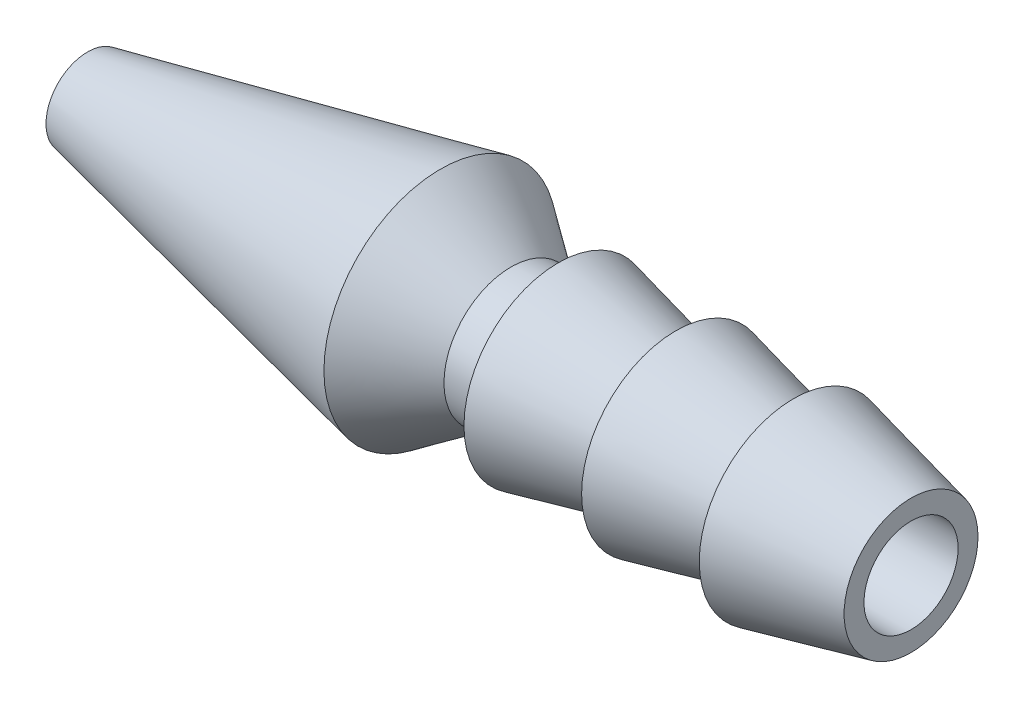
ISO-10303-21;
HEADER;
FILE_DESCRIPTION(('STEP AP214'),'2;1');
FILE_NAME('part.step','',(''),(''),'','','');
FILE_SCHEMA(('AUTOMOTIVE_DESIGN { 1 0 10303 214 1 1 1 1 }'));
ENDSEC;
DATA;
#1=APPLICATION_CONTEXT('core data for automotive mechanical design processes');
#2=APPLICATION_PROTOCOL_DEFINITION('international standard','automotive_design',2000,#1);
#3=PRODUCT_CONTEXT('',#1,'mechanical');
#4=PRODUCT('Part','Part','',(#3));
#5=PRODUCT_RELATED_PRODUCT_CATEGORY('part','',(#4));
#6=PRODUCT_DEFINITION_FORMATION('','',#4);
#7=PRODUCT_DEFINITION_CONTEXT('part definition',#1,'design');
#8=PRODUCT_DEFINITION('design','',#6,#7);
#9=PRODUCT_DEFINITION_SHAPE('','',#8);
#10=(LENGTH_UNIT() NAMED_UNIT(*) SI_UNIT(.MILLI.,.METRE.));
#11=(NAMED_UNIT(*) PLANE_ANGLE_UNIT() SI_UNIT($,.RADIAN.));
#12=(NAMED_UNIT(*) SI_UNIT($,.STERADIAN.) SOLID_ANGLE_UNIT());
#13=UNCERTAINTY_MEASURE_WITH_UNIT(LENGTH_MEASURE(1.E-05),#10,'distance_accuracy_value','');
#14=(GEOMETRIC_REPRESENTATION_CONTEXT(3) GLOBAL_UNCERTAINTY_ASSIGNED_CONTEXT((#13)) GLOBAL_UNIT_ASSIGNED_CONTEXT((#10,
#11,#12)) REPRESENTATION_CONTEXT('',''));
#15=CARTESIAN_POINT('',(0.,0.,0.));
#16=DIRECTION('',(0.,0.,1.));
#17=DIRECTION('',(1.,0.,0.));
#18=AXIS2_PLACEMENT_3D('',#15,#16,#17);
#19=CARTESIAN_POINT('',(-10.,0.,0.));
#20=DIRECTION('',(-1.,0.,0.));
#21=DIRECTION('',(0.,0.,1.));
#22=AXIS2_PLACEMENT_3D('',#19,#20,#21);
#23=PLANE('',#22);
#24=CARTESIAN_POINT('',(-10.,0.,0.));
#25=DIRECTION('',(-1.,0.,0.));
#26=DIRECTION('',(0.,0.,1.));
#27=AXIS2_PLACEMENT_3D('',#24,#25,#26);
#28=CIRCLE('',#27,1.00997333995951);
#29=CARTESIAN_POINT('',(-10.,0.2,-0.989972801358183));
#30=VERTEX_POINT('',#29);
#31=CARTESIAN_POINT('',(-10.,-0.2,-0.989972801358192));
#32=VERTEX_POINT('',#31);
#33=EDGE_CURVE('E11',#30,#32,#28,.T.);
#34=ORIENTED_EDGE('',*,*,#33,.F.);
#35=DIRECTION('',(0.,0.,-1.));
#36=VECTOR('',#35,1.);
#37=CARTESIAN_POINT('',(-10.,0.2,-1.23995684396675));
#38=LINE('',#37,#36);
#39=CARTESIAN_POINT('',(-10.,0.2,-1.23995684396675));
#40=VERTEX_POINT('',#39);
#41=EDGE_CURVE('E100',#30,#40,#38,.T.);
#42=ORIENTED_EDGE('',*,*,#41,.T.);
#43=DIRECTION('',(0.,-1.,0.));
#44=VECTOR('',#43,1.);
#45=CARTESIAN_POINT('',(-10.,0.2,-1.23995684396675));
#46=LINE('',#45,#44);
#47=CARTESIAN_POINT('',(-10.,-0.2,-1.23995684396675));
#48=VERTEX_POINT('',#47);
#49=EDGE_CURVE('E106',#40,#48,#46,.T.);
#50=ORIENTED_EDGE('',*,*,#49,.T.);
#51=DIRECTION('',(0.,0.,1.));
#52=VECTOR('',#51,1.);
#53=CARTESIAN_POINT('',(-10.,-0.2,-1.23995684396675));
#54=LINE('',#53,#52);
#55=EDGE_CURVE('E114',#48,#32,#54,.T.);
#56=ORIENTED_EDGE('',*,*,#55,.T.);
#57=EDGE_LOOP('',(#34,#42,#50,#56));
#58=FACE_BOUND('',#57,.T.);
#59=ADVANCED_FACE('F35',(#58),#23,.T.);
#60=CARTESIAN_POINT('',(0.,0.,0.));
#61=DIRECTION('',(-1.,0.,0.));
#62=DIRECTION('',(0.,0.,-1.));
#63=AXIS2_PLACEMENT_3D('',#60,#61,#62);
#64=CONICAL_SURFACE('',#63,4.,0.226892802759263);
#65=CARTESIAN_POINT('',(5.,0.,0.));
#66=DIRECTION('',(1.,0.,0.));
#67=DIRECTION('',(0.,0.,-1.));
#68=AXIS2_PLACEMENT_3D('',#65,#66,#67);
#69=CIRCLE('',#68,2.84565904437218);
#70=CARTESIAN_POINT('',(5.,0.,-2.84565904437218));
#71=VERTEX_POINT('',#70);
#72=EDGE_CURVE('E150',#71,#71,#69,.T.);
#73=ORIENTED_EDGE('',*,*,#72,.F.);
#74=EDGE_LOOP('',(#73));
#75=FACE_BOUND('',#74,.T.);
#76=CARTESIAN_POINT('',(0.,0.,0.));
#77=DIRECTION('',(1.,0.,0.));
#78=DIRECTION('',(0.,0.,-1.));
#79=AXIS2_PLACEMENT_3D('',#76,#77,#78);
#80=CIRCLE('',#79,4.);
#81=CARTESIAN_POINT('',(0.,0.,-4.));
#82=VERTEX_POINT('',#81);
#83=EDGE_CURVE('E162',#82,#82,#80,.T.);
#84=ORIENTED_EDGE('',*,*,#83,.T.);
#85=EDGE_LOOP('',(#84));
#86=FACE_BOUND('',#85,.T.);
#87=ADVANCED_FACE('F37',(#75,#86),#64,.T.);
#88=CARTESIAN_POINT('',(0.,0.,0.));
#89=DIRECTION('',(1.,0.,0.));
#90=DIRECTION('',(0.,0.,-1.));
#91=AXIS2_PLACEMENT_3D('',#88,#89,#90);
#92=PLANE('',#91);
#93=CARTESIAN_POINT('',(0.,0.,0.));
#94=DIRECTION('',(-1.,0.,0.));
#95=DIRECTION('',(0.,0.,1.));
#96=AXIS2_PLACEMENT_3D('',#93,#94,#95);
#97=CIRCLE('',#96,2.85);
#98=CARTESIAN_POINT('',(0.,0.,2.85));
#99=VERTEX_POINT('',#98);
#100=EDGE_CURVE('E92',#99,#99,#97,.T.);
#101=ORIENTED_EDGE('',*,*,#100,.F.);
#102=EDGE_LOOP('',(#101));
#103=FACE_BOUND('',#102,.T.);
#104=ORIENTED_EDGE('',*,*,#83,.F.);
#105=EDGE_LOOP('',(#104));
#106=FACE_BOUND('',#105,.T.);
#107=ADVANCED_FACE('F172',(#103,#106),#92,.F.);
#108=CARTESIAN_POINT('',(5.,0.,0.));
#109=DIRECTION('',(-1.,0.,0.));
#110=DIRECTION('',(0.,0.,-1.));
#111=AXIS2_PLACEMENT_3D('',#108,#109,#110);
#112=CONICAL_SURFACE('',#111,4.,0.226892802759263);
#113=CARTESIAN_POINT('',(10.,0.,0.));
#114=DIRECTION('',(1.,0.,0.));
#115=DIRECTION('',(0.,0.,-1.));
#116=AXIS2_PLACEMENT_3D('',#113,#114,#115);
#117=CIRCLE('',#116,2.84565904437218);
#118=CARTESIAN_POINT('',(10.,0.,-2.84565904437218));
#119=VERTEX_POINT('',#118);
#120=EDGE_CURVE('E159',#119,#119,#117,.T.);
#121=ORIENTED_EDGE('',*,*,#120,.F.);
#122=EDGE_LOOP('',(#121));
#123=FACE_BOUND('',#122,.T.);
#124=CARTESIAN_POINT('',(5.,0.,0.));
#125=DIRECTION('',(1.,0.,0.));
#126=DIRECTION('',(0.,0.,-1.));
#127=AXIS2_PLACEMENT_3D('',#124,#125,#126);
#128=CIRCLE('',#127,4.);
#129=CARTESIAN_POINT('',(5.,0.,-4.));
#130=VERTEX_POINT('',#129);
#131=EDGE_CURVE('E156',#130,#130,#128,.T.);
#132=ORIENTED_EDGE('',*,*,#131,.T.);
#133=EDGE_LOOP('',(#132));
#134=FACE_BOUND('',#133,.T.);
#135=ADVANCED_FACE('F176',(#123,#134),#112,.T.);
#136=CARTESIAN_POINT('',(5.,0.,0.));
#137=DIRECTION('',(1.,0.,0.));
#138=DIRECTION('',(0.,0.,-1.));
#139=AXIS2_PLACEMENT_3D('',#136,#137,#138);
#140=PLANE('',#139);
#141=ORIENTED_EDGE('',*,*,#72,.T.);
#142=EDGE_LOOP('',(#141));
#143=FACE_BOUND('',#142,.T.);
#144=ORIENTED_EDGE('',*,*,#131,.F.);
#145=EDGE_LOOP('',(#144));
#146=FACE_BOUND('',#145,.T.);
#147=ADVANCED_FACE('F167',(#143,#146),#140,.F.);
#148=CARTESIAN_POINT('',(10.,0.,0.));
#149=DIRECTION('',(-1.,0.,0.));
#150=DIRECTION('',(0.,0.,-1.));
#151=AXIS2_PLACEMENT_3D('',#148,#149,#150);
#152=CONICAL_SURFACE('',#151,4.,0.226892802759263);
#153=CARTESIAN_POINT('',(15.,0.,0.));
#154=DIRECTION('',(1.,0.,0.));
#155=DIRECTION('',(0.,0.,-1.));
#156=AXIS2_PLACEMENT_3D('',#153,#154,#155);
#157=CIRCLE('',#156,2.84565904437218);
#158=CARTESIAN_POINT('',(15.,0.,-2.84565904437218));
#159=VERTEX_POINT('',#158);
#160=EDGE_CURVE('E153',#159,#159,#157,.T.);
#161=ORIENTED_EDGE('',*,*,#160,.F.);
#162=EDGE_LOOP('',(#161));
#163=FACE_BOUND('',#162,.T.);
#164=CARTESIAN_POINT('',(10.,0.,0.));
#165=DIRECTION('',(1.,0.,0.));
#166=DIRECTION('',(0.,0.,-1.));
#167=AXIS2_PLACEMENT_3D('',#164,#165,#166);
#168=CIRCLE('',#167,4.);
#169=CARTESIAN_POINT('',(10.,0.,-4.));
#170=VERTEX_POINT('',#169);
#171=EDGE_CURVE('E147',#170,#170,#168,.T.);
#172=ORIENTED_EDGE('',*,*,#171,.T.);
#173=EDGE_LOOP('',(#172));
#174=FACE_BOUND('',#173,.T.);
#175=ADVANCED_FACE('F264',(#163,#174),#152,.T.);
#176=CARTESIAN_POINT('',(15.,0.,0.));
#177=DIRECTION('',(1.,0.,0.));
#178=DIRECTION('',(0.,0.,-1.));
#179=AXIS2_PLACEMENT_3D('',#176,#177,#178);
#180=PLANE('',#179);
#181=CARTESIAN_POINT('',(15.,0.,0.));
#182=DIRECTION('',(1.,0.,0.));
#183=DIRECTION('',(0.,0.,-1.));
#184=AXIS2_PLACEMENT_3D('',#181,#182,#183);
#185=CIRCLE('',#184,2.);
#186=CARTESIAN_POINT('',(15.,0.,-2.));
#187=VERTEX_POINT('',#186);
#188=EDGE_CURVE('E130',#187,#187,#185,.T.);
#189=ORIENTED_EDGE('',*,*,#188,.F.);
#190=EDGE_LOOP('',(#189));
#191=FACE_BOUND('',#190,.T.);
#192=ORIENTED_EDGE('',*,*,#160,.T.);
#193=EDGE_LOOP('',(#192));
#194=FACE_BOUND('',#193,.T.);
#195=ADVANCED_FACE('F259',(#191,#194),#180,.T.);
#196=CARTESIAN_POINT('',(10.,0.,0.));
#197=DIRECTION('',(1.,0.,0.));
#198=DIRECTION('',(0.,0.,-1.));
#199=AXIS2_PLACEMENT_3D('',#196,#197,#198);
#200=PLANE('',#199);
#201=ORIENTED_EDGE('',*,*,#120,.T.);
#202=EDGE_LOOP('',(#201));
#203=FACE_BOUND('',#202,.T.);
#204=ORIENTED_EDGE('',*,*,#171,.F.);
#205=EDGE_LOOP('',(#204));
#206=FACE_BOUND('',#205,.T.);
#207=ADVANCED_FACE('F254',(#203,#206),#200,.F.);
#208=CARTESIAN_POINT('',(-2.,0.,0.));
#209=DIRECTION('',(1.,0.,0.));
#210=DIRECTION('',(0.,0.,-1.));
#211=AXIS2_PLACEMENT_3D('',#208,#209,#210);
#212=CYLINDRICAL_SURFACE('',#211,2.85);
#213=CARTESIAN_POINT('',(-2.,0.,0.));
#214=DIRECTION('',(-1.,0.,0.));
#215=DIRECTION('',(0.,0.,1.));
#216=AXIS2_PLACEMENT_3D('',#213,#214,#215);
#217=CIRCLE('',#216,2.85);
#218=CARTESIAN_POINT('',(-2.,0.,2.85));
#219=VERTEX_POINT('',#218);
#220=EDGE_CURVE('E144',#219,#219,#217,.T.);
#221=ORIENTED_EDGE('',*,*,#220,.F.);
#222=EDGE_LOOP('',(#221));
#223=FACE_BOUND('',#222,.T.);
#224=ORIENTED_EDGE('',*,*,#100,.T.);
#225=EDGE_LOOP('',(#224));
#226=FACE_BOUND('',#225,.T.);
#227=ADVANCED_FACE('F248',(#223,#226),#212,.T.);
#228=CARTESIAN_POINT('',(-2.,0.,0.));
#229=DIRECTION('',(-1.,0.,0.));
#230=DIRECTION('',(0.,0.,1.));
#231=AXIS2_PLACEMENT_3D('',#228,#229,#230);
#232=CONICAL_SURFACE('',#231,2.85,0.610865238198016);
#233=CARTESIAN_POINT('',(-5.,0.,0.));
#234=DIRECTION('',(-1.,0.,0.));
#235=DIRECTION('',(0.,0.,1.));
#236=AXIS2_PLACEMENT_3D('',#233,#234,#235);
#237=CIRCLE('',#236,4.95062261462913);
#238=CARTESIAN_POINT('',(-5.,0.,4.95062261462913));
#239=VERTEX_POINT('',#238);
#240=EDGE_CURVE('E141',#239,#239,#237,.T.);
#241=ORIENTED_EDGE('',*,*,#240,.F.);
#242=EDGE_LOOP('',(#241));
#243=FACE_BOUND('',#242,.T.);
#244=ORIENTED_EDGE('',*,*,#220,.T.);
#245=EDGE_LOOP('',(#244));
#246=FACE_BOUND('',#245,.T.);
#247=ADVANCED_FACE('F242',(#243,#246),#232,.T.);
#248=CARTESIAN_POINT('',(-5.,0.,0.));
#249=DIRECTION('',(1.,0.,0.));
#250=DIRECTION('',(0.,0.,1.));
#251=AXIS2_PLACEMENT_3D('',#248,#249,#250);
#252=CONICAL_SURFACE('',#251,4.95062261462913,0.20943951023932);
#253=CARTESIAN_POINT('',(-20.,0.,0.));
#254=DIRECTION('',(-1.,0.,0.));
#255=DIRECTION('',(0.,0.,1.));
#256=AXIS2_PLACEMENT_3D('',#253,#254,#255);
#257=CIRCLE('',#256,1.7622741895788);
#258=CARTESIAN_POINT('',(-20.,0.,1.7622741895788));
#259=VERTEX_POINT('',#258);
#260=EDGE_CURVE('E138',#259,#259,#257,.T.);
#261=ORIENTED_EDGE('',*,*,#260,.F.);
#262=EDGE_LOOP('',(#261));
#263=FACE_BOUND('',#262,.T.);
#264=ORIENTED_EDGE('',*,*,#240,.T.);
#265=EDGE_LOOP('',(#264));
#266=FACE_BOUND('',#265,.T.);
#267=ADVANCED_FACE('F236',(#263,#266),#252,.T.);
#268=CARTESIAN_POINT('',(-20.,0.,0.));
#269=DIRECTION('',(-1.,0.,0.));
#270=DIRECTION('',(0.,0.,1.));
#271=AXIS2_PLACEMENT_3D('',#268,#269,#270);
#272=PLANE('',#271);
#273=DIRECTION('',(0.,1.,0.));
#274=VECTOR('',#273,1.);
#275=CARTESIAN_POINT('',(-20.,0.2,1.23995684396675));
#276=LINE('',#275,#274);
#277=CARTESIAN_POINT('',(-20.,-0.2,1.23995684396675));
#278=VERTEX_POINT('',#277);
#279=CARTESIAN_POINT('',(-20.,0.2,1.23995684396675));
#280=VERTEX_POINT('',#279);
#281=EDGE_CURVE('E57',#278,#280,#276,.T.);
#282=ORIENTED_EDGE('',*,*,#281,.F.);
#283=DIRECTION('',(0.,0.,1.));
#284=VECTOR('',#283,1.);
#285=CARTESIAN_POINT('',(-20.,-0.2,-1.23995684396675));
#286=LINE('',#285,#284);
#287=CARTESIAN_POINT('',(-20.,-0.2,-1.23995684396675));
#288=VERTEX_POINT('',#287);
#289=EDGE_CURVE('E125',#288,#278,#286,.T.);
#290=ORIENTED_EDGE('',*,*,#289,.F.);
#291=DIRECTION('',(0.,-1.,0.));
#292=VECTOR('',#291,1.);
#293=CARTESIAN_POINT('',(-20.,0.2,-1.23995684396675));
#294=LINE('',#293,#292);
#295=CARTESIAN_POINT('',(-20.,0.2,-1.23995684396675));
#296=VERTEX_POINT('',#295);
#297=EDGE_CURVE('E122',#296,#288,#294,.T.);
#298=ORIENTED_EDGE('',*,*,#297,.F.);
#299=DIRECTION('',(0.,0.,-1.));
#300=VECTOR('',#299,1.);
#301=CARTESIAN_POINT('',(-20.,0.2,-1.23995684396675));
#302=LINE('',#301,#300);
#303=EDGE_CURVE('E119',#280,#296,#302,.T.);
#304=ORIENTED_EDGE('',*,*,#303,.F.);
#305=EDGE_LOOP('',(#282,#290,#298,#304));
#306=FACE_BOUND('',#305,.T.);
#307=ORIENTED_EDGE('',*,*,#260,.T.);
#308=EDGE_LOOP('',(#307));
#309=FACE_BOUND('',#308,.T.);
#310=ADVANCED_FACE('F232',(#306,#309),#272,.T.);
#311=CARTESIAN_POINT('',(-5.,0.,0.));
#312=DIRECTION('',(1.,0.,0.));
#313=DIRECTION('',(0.,0.,-1.));
#314=AXIS2_PLACEMENT_3D('',#311,#312,#313);
#315=CYLINDRICAL_SURFACE('',#314,2.);
#316=CARTESIAN_POINT('',(-5.,0.,0.));
#317=DIRECTION('',(1.,0.,0.));
#318=DIRECTION('',(0.,0.,-1.));
#319=AXIS2_PLACEMENT_3D('',#316,#317,#318);
#320=CIRCLE('',#319,2.);
#321=CARTESIAN_POINT('',(-5.,0.,-2.));
#322=VERTEX_POINT('',#321);
#323=EDGE_CURVE('E101',#322,#322,#320,.T.);
#324=ORIENTED_EDGE('',*,*,#323,.F.);
#325=EDGE_LOOP('',(#324));
#326=FACE_BOUND('',#325,.T.);
#327=ORIENTED_EDGE('',*,*,#188,.T.);
#328=EDGE_LOOP('',(#327));
#329=FACE_BOUND('',#328,.T.);
#330=ADVANCED_FACE('F225',(#326,#329),#315,.F.);
#331=CARTESIAN_POINT('',(-10.,0.2,1.23995684396675));
#332=DIRECTION('',(0.,0.,1.));
#333=DIRECTION('',(1.,0.,0.));
#334=AXIS2_PLACEMENT_3D('',#331,#332,#333);
#335=PLANE('',#334);
#336=ORIENTED_EDGE('',*,*,#281,.T.);
#337=DIRECTION('',(-1.,0.,0.));
#338=VECTOR('',#337,1.);
#339=CARTESIAN_POINT('',(-10.,0.2,1.23995684396675));
#340=LINE('',#339,#338);
#341=CARTESIAN_POINT('',(-10.,0.2,1.23995684396675));
#342=VERTEX_POINT('',#341);
#343=EDGE_CURVE('E117',#342,#280,#340,.T.);
#344=ORIENTED_EDGE('',*,*,#343,.F.);
#345=DIRECTION('',(0.,1.,0.));
#346=VECTOR('',#345,1.);
#347=CARTESIAN_POINT('',(-10.,0.2,1.23995684396675));
#348=LINE('',#347,#346);
#349=CARTESIAN_POINT('',(-10.,-0.2,1.23995684396675));
#350=VERTEX_POINT('',#349);
#351=EDGE_CURVE('E105',#350,#342,#348,.T.);
#352=ORIENTED_EDGE('',*,*,#351,.F.);
#353=DIRECTION('',(-1.,0.,0.));
#354=VECTOR('',#353,1.);
#355=CARTESIAN_POINT('',(-10.,-0.2,1.23995684396675));
#356=LINE('',#355,#354);
#357=EDGE_CURVE('E128',#350,#278,#356,.T.);
#358=ORIENTED_EDGE('',*,*,#357,.T.);
#359=EDGE_LOOP('',(#336,#344,#352,#358));
#360=FACE_BOUND('',#359,.T.);
#361=ADVANCED_FACE('F206',(#360),#335,.F.);
#362=CARTESIAN_POINT('',(-10.,-0.2,-1.23995684396675));
#363=DIRECTION('',(0.,-1.,0.));
#364=DIRECTION('',(0.,0.,-1.));
#365=AXIS2_PLACEMENT_3D('',#362,#363,#364);
#366=PLANE('',#365);
#367=CARTESIAN_POINT('',(-10.,-0.2,0.989972801358182));
#368=VERTEX_POINT('',#367);
#369=EDGE_CURVE('E109',#368,#350,#54,.T.);
#370=ORIENTED_EDGE('',*,*,#369,.F.);
#371=CARTESIAN_POINT('',(-4.41858401245751,-0.2,2.10564652183967));
#372=CARTESIAN_POINT('',(-4.99757639961436,-0.2,1.99045983531643));
#373=CARTESIAN_POINT('',(-5.5765620950144,-0.2,1.8752388366557));
#374=CARTESIAN_POINT('',(-6.73453821814845,-0.2,1.64449490479169));
#375=CARTESIAN_POINT('',(-7.31352863965898,-0.2,1.52897194036653));
#376=CARTESIAN_POINT('',(-8.19260249892697,-0.2,1.35317184671917));
#377=CARTESIAN_POINT('',(-8.4927232493119,-0.2,1.29308136476466));
#378=CARTESIAN_POINT('',(-9.09292239704641,-0.2,1.1726867852655));
#379=CARTESIAN_POINT('',(-9.39300079433308,-0.2,1.11238268740689));
#380=CARTESIAN_POINT('',(-9.99305670426328,-0.2,0.991439433437263));
#381=CARTESIAN_POINT('',(-10.2930342242601,-0.2,0.93080031381298));
#382=CARTESIAN_POINT('',(-10.8928700775603,-0.2,0.808939258232777));
#383=CARTESIAN_POINT('',(-11.1927284113233,-0.2,0.747717324547703));
#384=CARTESIAN_POINT('',(-11.6423097111609,-0.2,0.654985749461904));
#385=CARTESIAN_POINT('',(-11.7921256185847,-0.2,0.623927583334646));
#386=CARTESIAN_POINT('',(-12.0916587063667,-0.2,0.561332964995804));
#387=CARTESIAN_POINT('',(-12.2413758859896,-0.2,0.529796509262796));
#388=CARTESIAN_POINT('',(-12.5406985008594,-0.2,0.465934478879929));
#389=CARTESIAN_POINT('',(-12.6903038779566,-0.2,0.43360862943196));
#390=CARTESIAN_POINT('',(-12.9144654360867,-0.2,0.38399236226799));
#391=CARTESIAN_POINT('',(-12.9891458408311,-0.2,0.367265466104436));
#392=CARTESIAN_POINT('',(-13.1383758984821,-0.2,0.333240026200018));
#393=CARTESIAN_POINT('',(-13.2129255522846,-0.2,0.315941486391798));
#394=CARTESIAN_POINT('',(-13.3617286783703,-0.2,0.280473481880032));
#395=CARTESIAN_POINT('',(-13.4359823955301,-0.2,0.26230506280384));
#396=CARTESIAN_POINT('',(-13.5470009200134,-0.2,0.233843028778246));
#397=CARTESIAN_POINT('',(-13.5839220658534,-0.2,0.2241610273903));
#398=CARTESIAN_POINT('',(-13.6576282111579,-0.2,0.20419755160386));
#399=CARTESIAN_POINT('',(-13.6944131153031,-0.2,0.193915719900114));
#400=CARTESIAN_POINT('',(-13.7677754918615,-0.2,0.172404847581174));
#401=CARTESIAN_POINT('',(-13.804352483969,-0.2,0.161174168265063));
#402=CARTESIAN_POINT('',(-13.8769653867224,-0.2,0.137164160952646));
#403=CARTESIAN_POINT('',(-13.9130019911954,-0.2,0.124387051954676));
#404=CARTESIAN_POINT('',(-13.9661532797245,-0.2,0.102518915920244));
#405=CARTESIAN_POINT('',(-13.9837854022991,-0.2,0.094744168786693));
#406=CARTESIAN_POINT('',(-14.009570116894,-0.2,0.0818278723908936));
#407=CARTESIAN_POINT('',(-14.0180385349626,-0.2,0.0773234313227546));
#408=CARTESIAN_POINT('',(-14.0346143950084,-0.2,0.0677004312428885));
#409=CARTESIAN_POINT('',(-14.0427224761883,-0.2,0.0625830244931657));
#410=CARTESIAN_POINT('',(-14.0547541945812,-0.2,0.053882939992768));
#411=CARTESIAN_POINT('',(-14.0589226691859,-0.2,0.0506422309814139));
#412=CARTESIAN_POINT('',(-14.0669166999522,-0.2,0.0437529156724499));
#413=CARTESIAN_POINT('',(-14.07074251132,-0.2,0.0401046175645451));
#414=CARTESIAN_POINT('',(-14.076569171207,-0.2,0.0336221554768863));
#415=CARTESIAN_POINT('',(-14.0787424751833,-0.2,0.0309450738210371));
#416=CARTESIAN_POINT('',(-14.0827020502332,-0.2,0.0253152043014893));
#417=CARTESIAN_POINT('',(-14.0844890074355,-0.2,0.0223629187578664));
#418=CARTESIAN_POINT('',(-14.0870677610602,-0.2,0.0170374617342815));
#419=CARTESIAN_POINT('',(-14.0879981089173,-0.2,0.0147324613126531));
#420=CARTESIAN_POINT('',(-14.08947184931,-0.2,0.0100022208212));
#421=CARTESIAN_POINT('',(-14.0900158918793,-0.2,0.00757719011819549));
#422=CARTESIAN_POINT('',(-14.0906527245538,-0.2,0.0026481079606061));
#423=CARTESIAN_POINT('',(-14.0907421484136,-0.2,0.000143604811542757));
#424=CARTESIAN_POINT('',(-14.0904473209313,-0.2,-0.004837753981347));
#425=CARTESIAN_POINT('',(-14.0900627466824,-0.2,-0.00731458961655574));
#426=CARTESIAN_POINT('',(-14.0887923707914,-0.2,-0.0124883286587482));
#427=CARTESIAN_POINT('',(-14.0878460952409,-0.2,-0.0151700068004449));
#428=CARTESIAN_POINT('',(-14.085535239559,-0.2,-0.0203455163331821));
#429=CARTESIAN_POINT('',(-14.0841698117279,-0.2,-0.0228389541738508));
#430=CARTESIAN_POINT('',(-14.0800787939955,-0.2,-0.0293132331120495));
#431=CARTESIAN_POINT('',(-14.0770704324407,-0.2,-0.0331124474908272));
#432=CARTESIAN_POINT('',(-14.0705578055322,-0.2,-0.0402551339052578));
#433=CARTESIAN_POINT('',(-14.0670519433856,-0.2,-0.0435970676144555));
#434=CARTESIAN_POINT('',(-14.0516465329549,-0.2,-0.0570315077867363));
#435=CARTESIAN_POINT('',(-14.0384456002262,-0.2,-0.0655786964034126));
#436=CARTESIAN_POINT('',(-14.0111995080469,-0.2,-0.0811830510665626));
#437=CARTESIAN_POINT('',(-13.9971487509851,-0.2,-0.0882285399638057));
#438=CARTESIAN_POINT('',(-13.966199958814,-0.2,-0.102541234275046));
#439=CARTESIAN_POINT('',(-13.9492231119918,-0.2,-0.109643466136129));
#440=CARTESIAN_POINT('',(-13.9149790450137,-0.2,-0.123116282411739));
#441=CARTESIAN_POINT('',(-13.8977115701522,-0.2,-0.129486182145927));
#442=CARTESIAN_POINT('',(-13.8455878875037,-0.2,-0.147887287604625));
#443=CARTESIAN_POINT('',(-13.8104723089576,-0.2,-0.159184060200833));
#444=CARTESIAN_POINT('',(-13.7399939983759,-0.2,-0.18072006160598));
#445=CARTESIAN_POINT('',(-13.7046317623281,-0.2,-0.190960983713966));
#446=CARTESIAN_POINT('',(-13.6337637913436,-0.2,-0.210762232308767));
#447=CARTESIAN_POINT('',(-13.5982582855484,-0.2,-0.220323377982841));
#448=CARTESIAN_POINT('',(-13.4920349168067,-0.2,-0.248219506719743));
#449=CARTESIAN_POINT('',(-13.4211470272535,-0.2,-0.26590119406753));
#450=CARTESIAN_POINT('',(-13.2791389621071,-0.2,-0.300315692622885));
#451=CARTESIAN_POINT('',(-13.2080187679771,-0.2,-0.317048426049939));
#452=CARTESIAN_POINT('',(-12.994366353241,-0.2,-0.36639233314999));
#453=CARTESIAN_POINT('',(-12.8516323756108,-0.2,-0.39812684899654));
#454=CARTESIAN_POINT('',(-12.5660700278136,-0.2,-0.460483626160384));
#455=CARTESIAN_POINT('',(-12.4232418817734,-0.2,-0.491106931593786));
#456=CARTESIAN_POINT('',(-12.1374886215786,-0.2,-0.551706820912083));
#457=CARTESIAN_POINT('',(-11.9945635440449,-0.2,-0.581683577278479));
#458=CARTESIAN_POINT('',(-11.5424863919766,-0.2,-0.675872131232695));
#459=CARTESIAN_POINT('',(-11.2331889065873,-0.2,-0.739383424780338));
#460=CARTESIAN_POINT('',(-10.6144350792175,-0.2,-0.865630872772105));
#461=CARTESIAN_POINT('',(-10.3049787364753,-0.2,-0.928367023463189));
#462=CARTESIAN_POINT('',(-9.68593628076487,-0.2,-1.05341376392662));
#463=CARTESIAN_POINT('',(-9.37635015587373,-0.2,-1.11572429468378));
#464=CARTESIAN_POINT('',(-8.75712667010178,-0.2,-1.24008663100592));
#465=CARTESIAN_POINT('',(-8.44748930932678,-0.2,-1.30213843709834));
#466=CARTESIAN_POINT('',(-7.51800301884208,-0.2,-1.48815277381981));
#467=CARTESIAN_POINT('',(-6.89810472629457,-0.2,-1.6118686088207));
#468=CARTESIAN_POINT('',(-5.96825670203048,-0.2,-1.79719843558343));
#469=CARTESIAN_POINT('',(-5.65833032955515,-0.2,-1.85892980488652));
#470=CARTESIAN_POINT('',(-5.03846549104666,-0.2,-1.98233056405531));
#471=CARTESIAN_POINT('',(-4.72852702502289,-0.2,-2.04399995396822));
#472=CARTESIAN_POINT('',(-4.41858401245751,-0.2,-2.10564652183967));
#473=B_SPLINE_CURVE_WITH_KNOTS('',3,(#371,#372,#373,#374,#375,#376,#377,#378,#379,#380,#381,
#382,#383,#384,#385,#386,#387,#388,#389,#390,#391,#392,#393,#394,#395,#396,#397,#398,#399,#400,
#401,#402,#403,#404,#405,#406,#407,#408,#409,#410,#411,#412,#413,#414,#415,#416,#417,#418,#419,
#420,#421,#422,#423,#424,#425,#426,#427,#428,#429,#430,#431,#432,#433,#434,#435,#436,#437,#438,
#439,#440,#441,#442,#443,#444,#445,#446,#447,#448,#449,#450,#451,#452,#453,#454,#455,#456,#457,
#458,#459,#460,#461,#462,#463,#464,#465,#466,#467,#468,#469,#470,#471,#472),.UNSPECIFIED.,.F.,
.F.,(4,2,2,2,2,2,2,2,2,2,2,2,2,2,2,2,2,2,2,2,2,2,2,2,2,2,2,2,2,2,2,2,2,2,2,2,2,2,2,2,2,2,2,2,2,
2,2,2,2,2,4),(0.,1.77101727844489,3.54222555117146,4.46045749521311,5.37869078935036,
6.2968259774545,7.21495758964922,7.67396110682749,8.13296800507695,8.59213703383428,
8.82172752202056,9.05131643105971,9.28063597415288,9.39514196874336,9.50971688255873,
9.62449388367224,9.73910809957445,9.79685832420144,9.82562121705789,9.85433086539625,
9.87015562658748,9.88596850219149,9.89629155912311,9.90659612952104,9.91402635165801,
9.9214440411825,9.92891657615242,9.936394204532,9.94487787224207,9.95337881176221,
9.96783475319427,9.98233818884989,10.0291486657932,10.0763108345398,10.1314699471968,
10.1866802175309,10.2973016404333,10.4077428027546,10.5180485355829,10.7372140281756,
10.9563974586683,11.3950427091333,11.8332645240012,12.2713679500504,13.2186178613727,
14.165872357236,15.1132556337506,16.0606369779675,17.9570057639749,18.9050490498409,
19.8530916128539),.UNSPECIFIED.);
#474=EDGE_CURVE('E49',#368,#32,#473,.T.);
#475=ORIENTED_EDGE('',*,*,#474,.T.);
#476=ORIENTED_EDGE('',*,*,#55,.F.);
#477=DIRECTION('',(-1.,0.,0.));
#478=VECTOR('',#477,1.);
#479=CARTESIAN_POINT('',(-10.,-0.2,-1.23995684396675));
#480=LINE('',#479,#478);
#481=EDGE_CURVE('E131',#48,#288,#480,.T.);
#482=ORIENTED_EDGE('',*,*,#481,.T.);
#483=ORIENTED_EDGE('',*,*,#289,.T.);
#484=ORIENTED_EDGE('',*,*,#357,.F.);
#485=EDGE_LOOP('',(#370,#475,#476,#482,#483,#484));
#486=FACE_BOUND('',#485,.T.);
#487=ADVANCED_FACE('F201',(#486),#366,.F.);
#488=CARTESIAN_POINT('',(-10.,0.2,-1.23995684396675));
#489=DIRECTION('',(0.,0.,-1.));
#490=DIRECTION('',(-1.,0.,0.));
#491=AXIS2_PLACEMENT_3D('',#488,#489,#490);
#492=PLANE('',#491);
#493=ORIENTED_EDGE('',*,*,#297,.T.);
#494=ORIENTED_EDGE('',*,*,#481,.F.);
#495=ORIENTED_EDGE('',*,*,#49,.F.);
#496=DIRECTION('',(-1.,0.,0.));
#497=VECTOR('',#496,1.);
#498=CARTESIAN_POINT('',(-10.,0.2,-1.23995684396675));
#499=LINE('',#498,#497);
#500=EDGE_CURVE('E133',#40,#296,#499,.T.);
#501=ORIENTED_EDGE('',*,*,#500,.T.);
#502=EDGE_LOOP('',(#493,#494,#495,#501));
#503=FACE_BOUND('',#502,.T.);
#504=ADVANCED_FACE('F196',(#503),#492,.F.);
#505=CARTESIAN_POINT('',(-10.,0.2,-1.23995684396675));
#506=DIRECTION('',(0.,1.,0.));
#507=DIRECTION('',(0.,0.,1.));
#508=AXIS2_PLACEMENT_3D('',#505,#506,#507);
#509=PLANE('',#508);
#510=ORIENTED_EDGE('',*,*,#41,.F.);
#511=CARTESIAN_POINT('',(-4.41858401245751,0.2,-2.10564652183967));
#512=CARTESIAN_POINT('',(-4.99757639961436,0.2,-1.99045983531643));
#513=CARTESIAN_POINT('',(-5.5765620950144,0.2,-1.8752388366557));
#514=CARTESIAN_POINT('',(-6.73453821814845,0.2,-1.64449490479169));
#515=CARTESIAN_POINT('',(-7.31352863965898,0.2,-1.52897194036653));
#516=CARTESIAN_POINT('',(-8.19260249892697,0.2,-1.35317184671917));
#517=CARTESIAN_POINT('',(-8.4927232493119,0.2,-1.29308136476466));
#518=CARTESIAN_POINT('',(-9.09292239704641,0.2,-1.1726867852655));
#519=CARTESIAN_POINT('',(-9.39300079433308,0.2,-1.11238268740689));
#520=CARTESIAN_POINT('',(-9.99305670426328,0.2,-0.991439433437263));
#521=CARTESIAN_POINT('',(-10.2930342242601,0.2,-0.93080031381298));
#522=CARTESIAN_POINT('',(-10.8928700775603,0.2,-0.808939258232777));
#523=CARTESIAN_POINT('',(-11.1927284113233,0.2,-0.747717324547703));
#524=CARTESIAN_POINT('',(-11.6423097111609,0.2,-0.654985749461904));
#525=CARTESIAN_POINT('',(-11.7921256185847,0.2,-0.623927583334646));
#526=CARTESIAN_POINT('',(-12.0916587063667,0.2,-0.561332964995804));
#527=CARTESIAN_POINT('',(-12.2413758859896,0.2,-0.529796509262796));
#528=CARTESIAN_POINT('',(-12.5406985008594,0.2,-0.465934478879929));
#529=CARTESIAN_POINT('',(-12.6903038779566,0.2,-0.43360862943196));
#530=CARTESIAN_POINT('',(-12.9144654360867,0.2,-0.383992362267991));
#531=CARTESIAN_POINT('',(-12.9891458408311,0.2,-0.367265466104436));
#532=CARTESIAN_POINT('',(-13.1383758984821,0.2,-0.333240026200018));
#533=CARTESIAN_POINT('',(-13.2129255522846,0.2,-0.315941486391798));
#534=CARTESIAN_POINT('',(-13.3617286783703,0.2,-0.280473481880032));
#535=CARTESIAN_POINT('',(-13.4359823955301,0.2,-0.26230506280384));
#536=CARTESIAN_POINT('',(-13.5470009200134,0.2,-0.233843028778246));
#537=CARTESIAN_POINT('',(-13.5839220658534,0.2,-0.2241610273903));
#538=CARTESIAN_POINT('',(-13.6576282111579,0.2,-0.20419755160386));
#539=CARTESIAN_POINT('',(-13.6944131153031,0.2,-0.193915719900114));
#540=CARTESIAN_POINT('',(-13.7677754918615,0.2,-0.172404847581174));
#541=CARTESIAN_POINT('',(-13.804352483969,0.2,-0.161174168265063));
#542=CARTESIAN_POINT('',(-13.8769653867224,0.2,-0.137164160952647));
#543=CARTESIAN_POINT('',(-13.9130019911954,0.2,-0.124387051954676));
#544=CARTESIAN_POINT('',(-13.9661532797245,0.2,-0.102518915920244));
#545=CARTESIAN_POINT('',(-13.9837854022991,0.2,-0.0947441687866936));
#546=CARTESIAN_POINT('',(-14.009570116894,0.2,-0.0818278723908937));
#547=CARTESIAN_POINT('',(-14.0180385349626,0.2,-0.0773234313227544));
#548=CARTESIAN_POINT('',(-14.0346143950084,0.2,-0.0677004312428882));
#549=CARTESIAN_POINT('',(-14.0427224761883,0.2,-0.0625830244931656));
#550=CARTESIAN_POINT('',(-14.0547541945812,0.2,-0.0538829399927679));
#551=CARTESIAN_POINT('',(-14.0589226691859,0.2,-0.0506422309814136));
#552=CARTESIAN_POINT('',(-14.0669166999522,0.2,-0.0437529156724493));
#553=CARTESIAN_POINT('',(-14.07074251132,0.2,-0.0401046175645442));
#554=CARTESIAN_POINT('',(-14.076569171207,0.2,-0.0336221554768859));
#555=CARTESIAN_POINT('',(-14.0787424751833,0.2,-0.0309450738210372));
#556=CARTESIAN_POINT('',(-14.0827020502332,0.2,-0.0253152043014897));
#557=CARTESIAN_POINT('',(-14.0844890074355,0.2,-0.0223629187578666));
#558=CARTESIAN_POINT('',(-14.0870677610602,0.2,-0.0170374617342817));
#559=CARTESIAN_POINT('',(-14.0879981089173,0.2,-0.0147324613126533));
#560=CARTESIAN_POINT('',(-14.08947184931,0.2,-0.0100022208212002));
#561=CARTESIAN_POINT('',(-14.0900158918793,0.2,-0.00757719011819566));
#562=CARTESIAN_POINT('',(-14.0906527245538,0.2,-0.00264810796060625));
#563=CARTESIAN_POINT('',(-14.0907421484136,0.2,-0.000143604811542914));
#564=CARTESIAN_POINT('',(-14.0904473209313,0.2,0.00483775398134684));
#565=CARTESIAN_POINT('',(-14.0900627466824,0.2,0.00731458961655559));
#566=CARTESIAN_POINT('',(-14.0887923707914,0.2,0.0124883286587481));
#567=CARTESIAN_POINT('',(-14.0878460952409,0.2,0.0151700068004449));
#568=CARTESIAN_POINT('',(-14.085535239559,0.2,0.0203455163331821));
#569=CARTESIAN_POINT('',(-14.0841698117279,0.2,0.0228389541738508));
#570=CARTESIAN_POINT('',(-14.0800787939955,0.2,0.0293132331120503));
#571=CARTESIAN_POINT('',(-14.0770704324407,0.2,0.0331124474908285));
#572=CARTESIAN_POINT('',(-14.0705578055322,0.2,0.0402551339052588));
#573=CARTESIAN_POINT('',(-14.0670519433856,0.2,0.0435970676144558));
#574=CARTESIAN_POINT('',(-14.0516465329549,0.2,0.057031507786736));
#575=CARTESIAN_POINT('',(-14.0384456002262,0.2,0.0655786964034123));
#576=CARTESIAN_POINT('',(-14.0111995080469,0.2,0.0811830510665622));
#577=CARTESIAN_POINT('',(-13.9971487509851,0.2,0.0882285399638053));
#578=CARTESIAN_POINT('',(-13.966199958814,0.2,0.102541234275046));
#579=CARTESIAN_POINT('',(-13.9492231119918,0.2,0.109643466136128));
#580=CARTESIAN_POINT('',(-13.9149790450137,0.2,0.123116282411738));
#581=CARTESIAN_POINT('',(-13.8977115701522,0.2,0.129486182145925));
#582=CARTESIAN_POINT('',(-13.8455878875037,0.2,0.147887287604624));
#583=CARTESIAN_POINT('',(-13.8104723089576,0.2,0.159184060200832));
#584=CARTESIAN_POINT('',(-13.7399939983759,0.2,0.18072006160598));
#585=CARTESIAN_POINT('',(-13.7046317623281,0.2,0.190960983713965));
#586=CARTESIAN_POINT('',(-13.6337637913436,0.2,0.210762232308767));
#587=CARTESIAN_POINT('',(-13.5982582855484,0.2,0.220323377982841));
#588=CARTESIAN_POINT('',(-13.4920349168067,0.2,0.248219506719744));
#589=CARTESIAN_POINT('',(-13.4211470272535,0.2,0.265901194067531));
#590=CARTESIAN_POINT('',(-13.2791389621071,0.2,0.300315692622885));
#591=CARTESIAN_POINT('',(-13.208018767977,0.2,0.31704842604994));
#592=CARTESIAN_POINT('',(-12.9943663532409,0.2,0.366392333149991));
#593=CARTESIAN_POINT('',(-12.8516323756108,0.2,0.398126848996541));
#594=CARTESIAN_POINT('',(-12.5660700278136,0.2,0.460483626160386));
#595=CARTESIAN_POINT('',(-12.4232418817734,0.2,0.491106931593788));
#596=CARTESIAN_POINT('',(-12.1374886215785,0.2,0.551706820912085));
#597=CARTESIAN_POINT('',(-11.9945635440449,0.2,0.581683577278481));
#598=CARTESIAN_POINT('',(-11.5424863919766,0.2,0.675872131232697));
#599=CARTESIAN_POINT('',(-11.2331889065873,0.2,0.739383424780339));
#600=CARTESIAN_POINT('',(-10.6144350792175,0.2,0.865630872772106));
#601=CARTESIAN_POINT('',(-10.3049787364753,0.2,0.928367023463189));
#602=CARTESIAN_POINT('',(-9.68593628076487,0.2,1.05341376392662));
#603=CARTESIAN_POINT('',(-9.37635015587373,0.2,1.11572429468378));
#604=CARTESIAN_POINT('',(-8.75712667010179,0.2,1.24008663100592));
#605=CARTESIAN_POINT('',(-8.44748930932678,0.2,1.30213843709833));
#606=CARTESIAN_POINT('',(-7.51800301884209,0.2,1.48815277381981));
#607=CARTESIAN_POINT('',(-6.89810472629457,0.2,1.6118686088207));
#608=CARTESIAN_POINT('',(-5.96825670203049,0.2,1.79719843558343));
#609=CARTESIAN_POINT('',(-5.65833032955516,0.2,1.85892980488652));
#610=CARTESIAN_POINT('',(-5.03846549104666,0.2,1.98233056405531));
#611=CARTESIAN_POINT('',(-4.72852702502289,0.2,2.04399995396822));
#612=CARTESIAN_POINT('',(-4.41858401245751,0.2,2.10564652183967));
#613=B_SPLINE_CURVE_WITH_KNOTS('',3,(#511,#512,#513,#514,#515,#516,#517,#518,#519,#520,#521,
#522,#523,#524,#525,#526,#527,#528,#529,#530,#531,#532,#533,#534,#535,#536,#537,#538,#539,#540,
#541,#542,#543,#544,#545,#546,#547,#548,#549,#550,#551,#552,#553,#554,#555,#556,#557,#558,#559,
#560,#561,#562,#563,#564,#565,#566,#567,#568,#569,#570,#571,#572,#573,#574,#575,#576,#577,#578,
#579,#580,#581,#582,#583,#584,#585,#586,#587,#588,#589,#590,#591,#592,#593,#594,#595,#596,#597,
#598,#599,#600,#601,#602,#603,#604,#605,#606,#607,#608,#609,#610,#611,#612),.UNSPECIFIED.,.F.,
.F.,(4,2,2,2,2,2,2,2,2,2,2,2,2,2,2,2,2,2,2,2,2,2,2,2,2,2,2,2,2,2,2,2,2,2,2,2,2,2,2,2,2,2,2,2,2,
2,2,2,2,2,4),(0.,1.77101727844489,3.54222555117146,4.46045749521311,5.37869078935036,
6.2968259774545,7.21495758964922,7.67396110682749,8.13296800507695,8.59213703383428,
8.82172752202056,9.05131643105971,9.28063597415288,9.39514196874336,9.50971688255873,
9.62449388367224,9.73910809957445,9.79685832420144,9.82562121705789,9.85433086539625,
9.87015562658748,9.88596850219149,9.89629155912311,9.90659612952104,9.91402635165801,
9.9214440411825,9.92891657615242,9.936394204532,9.94487787224207,9.95337881176222,
9.96783475319428,9.9823381888499,10.0291486657932,10.0763108345398,10.1314699471968,
10.1866802175309,10.2973016404333,10.4077428027546,10.5180485355829,10.7372140281756,
10.9563974586683,11.3950427091333,11.8332645240012,12.2713679500504,13.2186178613727,
14.165872357236,15.1132556337506,16.0606369779675,17.9570057639749,18.9050490498409,
19.8530916128539),.UNSPECIFIED.);
#614=CARTESIAN_POINT('',(-10.,0.2,0.989972801358182));
#615=VERTEX_POINT('',#614);
#616=EDGE_CURVE('E87',#30,#615,#613,.T.);
#617=ORIENTED_EDGE('',*,*,#616,.T.);
#618=EDGE_CURVE('E97',#342,#615,#38,.T.);
#619=ORIENTED_EDGE('',*,*,#618,.F.);
#620=ORIENTED_EDGE('',*,*,#343,.T.);
#621=ORIENTED_EDGE('',*,*,#303,.T.);
#622=ORIENTED_EDGE('',*,*,#500,.F.);
#623=EDGE_LOOP('',(#510,#617,#619,#620,#621,#622));
#624=FACE_BOUND('',#623,.T.);
#625=ADVANCED_FACE('F96',(#624),#509,.F.);
#626=EDGE_CURVE('E39',#368,#615,#28,.T.);
#627=ORIENTED_EDGE('',*,*,#626,.F.);
#628=ORIENTED_EDGE('',*,*,#369,.T.);
#629=ORIENTED_EDGE('',*,*,#351,.T.);
#630=ORIENTED_EDGE('',*,*,#618,.T.);
#631=EDGE_LOOP('',(#627,#628,#629,#630));
#632=FACE_BOUND('',#631,.T.);
#633=ADVANCED_FACE('F103',(#632),#23,.T.);
#634=CARTESIAN_POINT('',(-5.,0.,0.));
#635=DIRECTION('',(1.,0.,0.));
#636=DIRECTION('',(0.,0.,-1.));
#637=AXIS2_PLACEMENT_3D('',#634,#635,#636);
#638=CONICAL_SURFACE('',#637,2.,0.195476876223365);
#639=ORIENTED_EDGE('',*,*,#33,.T.);
#640=ORIENTED_EDGE('',*,*,#474,.F.);
#641=ORIENTED_EDGE('',*,*,#626,.T.);
#642=ORIENTED_EDGE('',*,*,#616,.F.);
#643=EDGE_LOOP('',(#639,#640,#641,#642));
#644=FACE_BOUND('',#643,.T.);
#645=ORIENTED_EDGE('',*,*,#323,.T.);
#646=EDGE_LOOP('',(#645));
#647=FACE_BOUND('',#646,.T.);
#648=ADVANCED_FACE('F85',(#644,#647),#638,.F.);
#649=CLOSED_SHELL('',(#59,#87,#107,#135,#147,#175,#195,#207,#227,#247,#267,#310,#330,#361,#487,
#504,#625,#633,#648));
#650=MANIFOLD_SOLID_BREP('B2',#649);
#651=ADVANCED_BREP_SHAPE_REPRESENTATION('',(#18,#650),#14);
#652=SHAPE_DEFINITION_REPRESENTATION(#9,#651);
ENDSEC;
END-ISO-10303-21;
